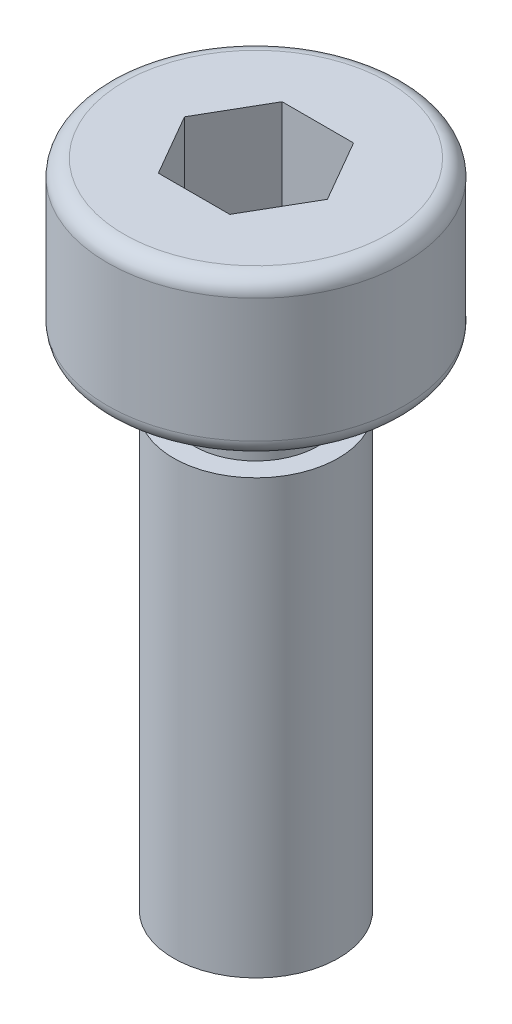
ISO-10303-21;
HEADER;
FILE_DESCRIPTION(('STEP AP214'),'2;1');
FILE_NAME('part.step','',(''),(''),'','','');
FILE_SCHEMA(('AUTOMOTIVE_DESIGN { 1 0 10303 214 1 1 1 1 }'));
ENDSEC;
DATA;
#1=APPLICATION_CONTEXT('core data for automotive mechanical design processes');
#2=APPLICATION_PROTOCOL_DEFINITION('international standard','automotive_design',2000,#1);
#3=PRODUCT_CONTEXT('',#1,'mechanical');
#4=PRODUCT('Part','Part','',(#3));
#5=PRODUCT_RELATED_PRODUCT_CATEGORY('part','',(#4));
#6=PRODUCT_DEFINITION_FORMATION('','',#4);
#7=PRODUCT_DEFINITION_CONTEXT('part definition',#1,'design');
#8=PRODUCT_DEFINITION('design','',#6,#7);
#9=PRODUCT_DEFINITION_SHAPE('','',#8);
#10=(LENGTH_UNIT() NAMED_UNIT(*) SI_UNIT(.MILLI.,.METRE.));
#11=(NAMED_UNIT(*) PLANE_ANGLE_UNIT() SI_UNIT($,.RADIAN.));
#12=(NAMED_UNIT(*) SI_UNIT($,.STERADIAN.) SOLID_ANGLE_UNIT());
#13=UNCERTAINTY_MEASURE_WITH_UNIT(LENGTH_MEASURE(1.E-05),#10,'distance_accuracy_value','');
#14=(GEOMETRIC_REPRESENTATION_CONTEXT(3) GLOBAL_UNCERTAINTY_ASSIGNED_CONTEXT((#13)) GLOBAL_UNIT_ASSIGNED_CONTEXT((#10,
#11,#12)) REPRESENTATION_CONTEXT('',''));
#15=CARTESIAN_POINT('',(0.,0.,0.));
#16=DIRECTION('',(0.,0.,1.));
#17=DIRECTION('',(1.,0.,0.));
#18=AXIS2_PLACEMENT_3D('',#15,#16,#17);
#19=CARTESIAN_POINT('',(0.,15.8,0.));
#20=DIRECTION('',(0.,-1.,0.));
#21=DIRECTION('',(0.,0.,-1.));
#22=AXIS2_PLACEMENT_3D('',#19,#20,#21);
#23=PLANE('',#22);
#24=DIRECTION('',(-0.5,0.,0.866025403784439));
#25=VECTOR('',#24,1.);
#26=CARTESIAN_POINT('',(-0.866025403784439,15.8,-1.5));
#27=LINE('',#26,#25);
#28=CARTESIAN_POINT('',(-0.866025403784439,15.8,-1.5));
#29=VERTEX_POINT('',#28);
#30=CARTESIAN_POINT('',(-1.73205080756888,15.8,0.));
#31=VERTEX_POINT('',#30);
#32=EDGE_CURVE('E124',#29,#31,#27,.T.);
#33=ORIENTED_EDGE('',*,*,#32,.F.);
#34=DIRECTION('',(-1.,0.,0.));
#35=VECTOR('',#34,1.);
#36=CARTESIAN_POINT('',(0.86602540378444,15.8,-1.5));
#37=LINE('',#36,#35);
#38=CARTESIAN_POINT('',(0.86602540378444,15.8,-1.5));
#39=VERTEX_POINT('',#38);
#40=EDGE_CURVE('E50',#39,#29,#37,.T.);
#41=ORIENTED_EDGE('',*,*,#40,.F.);
#42=DIRECTION('',(-0.5,0.,-0.866025403784439));
#43=VECTOR('',#42,1.);
#44=CARTESIAN_POINT('',(1.73205080756888,15.8,0.));
#45=LINE('',#44,#43);
#46=CARTESIAN_POINT('',(1.73205080756888,15.8,0.));
#47=VERTEX_POINT('',#46);
#48=EDGE_CURVE('E133',#47,#39,#45,.T.);
#49=ORIENTED_EDGE('',*,*,#48,.F.);
#50=DIRECTION('',(0.5,0.,-0.866025403784439));
#51=VECTOR('',#50,1.);
#52=CARTESIAN_POINT('',(0.866025403784438,15.8,1.5));
#53=LINE('',#52,#51);
#54=CARTESIAN_POINT('',(0.866025403784438,15.8,1.5));
#55=VERTEX_POINT('',#54);
#56=EDGE_CURVE('E131',#55,#47,#53,.T.);
#57=ORIENTED_EDGE('',*,*,#56,.F.);
#58=DIRECTION('',(1.,0.,0.));
#59=VECTOR('',#58,1.);
#60=CARTESIAN_POINT('',(-0.86602540378444,15.8,1.5));
#61=LINE('',#60,#59);
#62=CARTESIAN_POINT('',(-0.86602540378444,15.8,1.5));
#63=VERTEX_POINT('',#62);
#64=EDGE_CURVE('E98',#63,#55,#61,.T.);
#65=ORIENTED_EDGE('',*,*,#64,.F.);
#66=DIRECTION('',(0.5,0.,0.866025403784439));
#67=VECTOR('',#66,1.);
#68=CARTESIAN_POINT('',(-1.73205080756888,15.8,0.));
#69=LINE('',#68,#67);
#70=EDGE_CURVE('E127',#31,#63,#69,.T.);
#71=ORIENTED_EDGE('',*,*,#70,.F.);
#72=EDGE_LOOP('',(#33,#41,#49,#57,#65,#71));
#73=FACE_BOUND('',#72,.T.);
#74=CARTESIAN_POINT('',(0.,15.8,0.));
#75=DIRECTION('',(0.,-1.,0.));
#76=DIRECTION('',(0.,0.,-1.));
#77=AXIS2_PLACEMENT_3D('',#74,#75,#76);
#78=CIRCLE('',#77,3.2);
#79=CARTESIAN_POINT('',(0.,15.8,-3.2));
#80=VERTEX_POINT('',#79);
#81=EDGE_CURVE('E11',#80,#80,#78,.T.);
#82=ORIENTED_EDGE('',*,*,#81,.F.);
#83=EDGE_LOOP('',(#82));
#84=FACE_BOUND('',#83,.T.);
#85=ADVANCED_FACE('F36',(#73,#84),#23,.F.);
#86=CARTESIAN_POINT('',(0.,15.4,0.));
#87=DIRECTION('',(0.,-1.,0.));
#88=DIRECTION('',(0.,0.,-1.));
#89=AXIS2_PLACEMENT_3D('',#86,#87,#88);
#90=TOROIDAL_SURFACE('',#89,3.2,0.4);
#91=CARTESIAN_POINT('',(0.,15.4,0.));
#92=DIRECTION('',(0.,-1.,0.));
#93=DIRECTION('',(0.,0.,-1.));
#94=AXIS2_PLACEMENT_3D('',#91,#92,#93);
#95=CIRCLE('',#94,3.6);
#96=CARTESIAN_POINT('',(0.,15.4,-3.6));
#97=VERTEX_POINT('',#96);
#98=EDGE_CURVE('E43',#97,#97,#95,.T.);
#99=ORIENTED_EDGE('',*,*,#98,.F.);
#100=EDGE_LOOP('',(#99));
#101=FACE_BOUND('',#100,.T.);
#102=ORIENTED_EDGE('',*,*,#81,.T.);
#103=EDGE_LOOP('',(#102));
#104=FACE_BOUND('',#103,.T.);
#105=ADVANCED_FACE('F164',(#101,#104),#90,.T.);
#106=CARTESIAN_POINT('',(0.,0.,0.));
#107=DIRECTION('',(0.,-1.,0.));
#108=DIRECTION('',(0.,0.,-1.));
#109=AXIS2_PLACEMENT_3D('',#106,#107,#108);
#110=CYLINDRICAL_SURFACE('',#109,3.6);
#111=CARTESIAN_POINT('',(0.,12.4,0.));
#112=DIRECTION('',(0.,-1.,0.));
#113=DIRECTION('',(0.,0.,-1.));
#114=AXIS2_PLACEMENT_3D('',#111,#112,#113);
#115=CIRCLE('',#114,3.6);
#116=CARTESIAN_POINT('',(0.,12.4,-3.6));
#117=VERTEX_POINT('',#116);
#118=EDGE_CURVE('E157',#117,#117,#115,.T.);
#119=ORIENTED_EDGE('',*,*,#118,.F.);
#120=EDGE_LOOP('',(#119));
#121=FACE_BOUND('',#120,.T.);
#122=ORIENTED_EDGE('',*,*,#98,.T.);
#123=EDGE_LOOP('',(#122));
#124=FACE_BOUND('',#123,.T.);
#125=ADVANCED_FACE('F162',(#121,#124),#110,.T.);
#126=CARTESIAN_POINT('',(0.,12.4,0.));
#127=DIRECTION('',(0.,-1.,0.));
#128=DIRECTION('',(0.,0.,-1.));
#129=AXIS2_PLACEMENT_3D('',#126,#127,#128);
#130=TOROIDAL_SURFACE('',#129,3.2,0.4);
#131=CARTESIAN_POINT('',(0.,12.,0.));
#132=DIRECTION('',(0.,-1.,0.));
#133=DIRECTION('',(0.,0.,-1.));
#134=AXIS2_PLACEMENT_3D('',#131,#132,#133);
#135=CIRCLE('',#134,3.2);
#136=CARTESIAN_POINT('',(0.,12.,-3.2));
#137=VERTEX_POINT('',#136);
#138=EDGE_CURVE('E154',#137,#137,#135,.T.);
#139=ORIENTED_EDGE('',*,*,#138,.F.);
#140=EDGE_LOOP('',(#139));
#141=FACE_BOUND('',#140,.T.);
#142=ORIENTED_EDGE('',*,*,#118,.T.);
#143=EDGE_LOOP('',(#142));
#144=FACE_BOUND('',#143,.T.);
#145=ADVANCED_FACE('F209',(#141,#144),#130,.T.);
#146=CARTESIAN_POINT('',(-3.2,12.,0.));
#147=DIRECTION('',(0.,1.,0.));
#148=DIRECTION('',(0.,0.,1.));
#149=AXIS2_PLACEMENT_3D('',#146,#147,#148);
#150=PLANE('',#149);
#151=CARTESIAN_POINT('',(0.,12.,0.));
#152=DIRECTION('',(0.,-1.,0.));
#153=DIRECTION('',(0.,0.,-1.));
#154=AXIS2_PLACEMENT_3D('',#151,#152,#153);
#155=CIRCLE('',#154,1.5);
#156=CARTESIAN_POINT('',(0.,12.,-1.5));
#157=VERTEX_POINT('',#156);
#158=EDGE_CURVE('E151',#157,#157,#155,.T.);
#159=ORIENTED_EDGE('',*,*,#158,.F.);
#160=EDGE_LOOP('',(#159));
#161=FACE_BOUND('',#160,.T.);
#162=ORIENTED_EDGE('',*,*,#138,.T.);
#163=EDGE_LOOP('',(#162));
#164=FACE_BOUND('',#163,.T.);
#165=ADVANCED_FACE('F205',(#161,#164),#150,.F.);
#166=CARTESIAN_POINT('',(0.,0.,0.));
#167=DIRECTION('',(0.,-1.,0.));
#168=DIRECTION('',(0.,0.,-1.));
#169=AXIS2_PLACEMENT_3D('',#166,#167,#168);
#170=CYLINDRICAL_SURFACE('',#169,1.5);
#171=CARTESIAN_POINT('',(0.,10.5,0.));
#172=DIRECTION('',(0.,-1.,0.));
#173=DIRECTION('',(0.,0.,-1.));
#174=AXIS2_PLACEMENT_3D('',#171,#172,#173);
#175=CIRCLE('',#174,1.5);
#176=CARTESIAN_POINT('',(0.,10.5,-1.5));
#177=VERTEX_POINT('',#176);
#178=EDGE_CURVE('E148',#177,#177,#175,.T.);
#179=ORIENTED_EDGE('',*,*,#178,.F.);
#180=EDGE_LOOP('',(#179));
#181=FACE_BOUND('',#180,.T.);
#182=ORIENTED_EDGE('',*,*,#158,.T.);
#183=EDGE_LOOP('',(#182));
#184=FACE_BOUND('',#183,.T.);
#185=ADVANCED_FACE('F201',(#181,#184),#170,.T.);
#186=CARTESIAN_POINT('',(-1.5,10.5,0.));
#187=DIRECTION('',(0.,-1.,0.));
#188=DIRECTION('',(0.,0.,-1.));
#189=AXIS2_PLACEMENT_3D('',#186,#187,#188);
#190=PLANE('',#189);
#191=CARTESIAN_POINT('',(0.,10.5,0.));
#192=DIRECTION('',(0.,-1.,0.));
#193=DIRECTION('',(0.,0.,-1.));
#194=AXIS2_PLACEMENT_3D('',#191,#192,#193);
#195=CIRCLE('',#194,2.);
#196=CARTESIAN_POINT('',(0.,10.5,-2.));
#197=VERTEX_POINT('',#196);
#198=EDGE_CURVE('E145',#197,#197,#195,.T.);
#199=ORIENTED_EDGE('',*,*,#198,.F.);
#200=EDGE_LOOP('',(#199));
#201=FACE_BOUND('',#200,.T.);
#202=ORIENTED_EDGE('',*,*,#178,.T.);
#203=EDGE_LOOP('',(#202));
#204=FACE_BOUND('',#203,.T.);
#205=ADVANCED_FACE('F197',(#201,#204),#190,.F.);
#206=CARTESIAN_POINT('',(0.,0.,0.));
#207=DIRECTION('',(0.,-1.,0.));
#208=DIRECTION('',(0.,0.,-1.));
#209=AXIS2_PLACEMENT_3D('',#206,#207,#208);
#210=CYLINDRICAL_SURFACE('',#209,2.);
#211=CARTESIAN_POINT('',(0.,0.,0.));
#212=DIRECTION('',(0.,-1.,0.));
#213=DIRECTION('',(0.,0.,-1.));
#214=AXIS2_PLACEMENT_3D('',#211,#212,#213);
#215=CIRCLE('',#214,2.);
#216=CARTESIAN_POINT('',(0.,0.,-2.));
#217=VERTEX_POINT('',#216);
#218=EDGE_CURVE('E137',#217,#217,#215,.T.);
#219=ORIENTED_EDGE('',*,*,#218,.F.);
#220=EDGE_LOOP('',(#219));
#221=FACE_BOUND('',#220,.T.);
#222=ORIENTED_EDGE('',*,*,#198,.T.);
#223=EDGE_LOOP('',(#222));
#224=FACE_BOUND('',#223,.T.);
#225=ADVANCED_FACE('F189',(#221,#224),#210,.T.);
#226=CARTESIAN_POINT('',(-2.,0.,0.));
#227=DIRECTION('',(0.,1.,0.));
#228=DIRECTION('',(0.,0.,1.));
#229=AXIS2_PLACEMENT_3D('',#226,#227,#228);
#230=PLANE('',#229);
#231=ORIENTED_EDGE('',*,*,#218,.T.);
#232=EDGE_LOOP('',(#231));
#233=FACE_BOUND('',#232,.T.);
#234=ADVANCED_FACE('F182',(#233),#230,.F.);
#235=CARTESIAN_POINT('',(0.86602540378444,13.,-1.5));
#236=DIRECTION('',(0.,0.,-1.));
#237=DIRECTION('',(-1.,0.,0.));
#238=AXIS2_PLACEMENT_3D('',#235,#236,#237);
#239=PLANE('',#238);
#240=ORIENTED_EDGE('',*,*,#40,.T.);
#241=DIRECTION('',(0.,1.,0.));
#242=VECTOR('',#241,1.);
#243=CARTESIAN_POINT('',(-0.866025403784439,13.,-1.5));
#244=LINE('',#243,#242);
#245=CARTESIAN_POINT('',(-0.866025403784439,13.,-1.5));
#246=VERTEX_POINT('',#245);
#247=EDGE_CURVE('E80',#246,#29,#244,.T.);
#248=ORIENTED_EDGE('',*,*,#247,.F.);
#249=DIRECTION('',(-1.,0.,0.));
#250=VECTOR('',#249,1.);
#251=CARTESIAN_POINT('',(0.86602540378444,13.,-1.5));
#252=LINE('',#251,#250);
#253=CARTESIAN_POINT('',(0.86602540378444,13.,-1.5));
#254=VERTEX_POINT('',#253);
#255=EDGE_CURVE('E135',#254,#246,#252,.T.);
#256=ORIENTED_EDGE('',*,*,#255,.F.);
#257=DIRECTION('',(0.,1.,0.));
#258=VECTOR('',#257,1.);
#259=CARTESIAN_POINT('',(0.86602540378444,13.,-1.5));
#260=LINE('',#259,#258);
#261=EDGE_CURVE('E58',#254,#39,#260,.T.);
#262=ORIENTED_EDGE('',*,*,#261,.T.);
#263=EDGE_LOOP('',(#240,#248,#256,#262));
#264=FACE_BOUND('',#263,.T.);
#265=ADVANCED_FACE('F179',(#264),#239,.F.);
#266=CARTESIAN_POINT('',(1.73205080756888,13.,0.));
#267=DIRECTION('',(0.866025403784439,0.,-0.5));
#268=DIRECTION('',(-0.5,0.,-0.866025403784439));
#269=AXIS2_PLACEMENT_3D('',#266,#267,#268);
#270=PLANE('',#269);
#271=ORIENTED_EDGE('',*,*,#48,.T.);
#272=ORIENTED_EDGE('',*,*,#261,.F.);
#273=DIRECTION('',(-0.5,0.,-0.866025403784439));
#274=VECTOR('',#273,1.);
#275=CARTESIAN_POINT('',(1.73205080756888,13.,0.));
#276=LINE('',#275,#274);
#277=CARTESIAN_POINT('',(1.73205080756888,13.,0.));
#278=VERTEX_POINT('',#277);
#279=EDGE_CURVE('E110',#278,#254,#276,.T.);
#280=ORIENTED_EDGE('',*,*,#279,.F.);
#281=DIRECTION('',(0.,1.,0.));
#282=VECTOR('',#281,1.);
#283=CARTESIAN_POINT('',(1.73205080756888,13.,0.));
#284=LINE('',#283,#282);
#285=EDGE_CURVE('E102',#278,#47,#284,.T.);
#286=ORIENTED_EDGE('',*,*,#285,.T.);
#287=EDGE_LOOP('',(#271,#272,#280,#286));
#288=FACE_BOUND('',#287,.T.);
#289=ADVANCED_FACE('F181',(#288),#270,.F.);
#290=CARTESIAN_POINT('',(0.866025403784438,13.,1.5));
#291=DIRECTION('',(0.866025403784439,0.,0.5));
#292=DIRECTION('',(0.5,0.,-0.866025403784438));
#293=AXIS2_PLACEMENT_3D('',#290,#291,#292);
#294=PLANE('',#293);
#295=ORIENTED_EDGE('',*,*,#56,.T.);
#296=ORIENTED_EDGE('',*,*,#285,.F.);
#297=DIRECTION('',(0.5,0.,-0.866025403784439));
#298=VECTOR('',#297,1.);
#299=CARTESIAN_POINT('',(0.866025403784438,13.,1.5));
#300=LINE('',#299,#298);
#301=CARTESIAN_POINT('',(0.866025403784438,13.,1.5));
#302=VERTEX_POINT('',#301);
#303=EDGE_CURVE('E106',#302,#278,#300,.T.);
#304=ORIENTED_EDGE('',*,*,#303,.F.);
#305=DIRECTION('',(0.,1.,0.));
#306=VECTOR('',#305,1.);
#307=CARTESIAN_POINT('',(0.866025403784438,13.,1.5));
#308=LINE('',#307,#306);
#309=EDGE_CURVE('E91',#302,#55,#308,.T.);
#310=ORIENTED_EDGE('',*,*,#309,.T.);
#311=EDGE_LOOP('',(#295,#296,#304,#310));
#312=FACE_BOUND('',#311,.T.);
#313=ADVANCED_FACE('F107',(#312),#294,.F.);
#314=CARTESIAN_POINT('',(-0.86602540378444,13.,1.5));
#315=DIRECTION('',(0.,0.,1.));
#316=DIRECTION('',(1.,0.,0.));
#317=AXIS2_PLACEMENT_3D('',#314,#315,#316);
#318=PLANE('',#317);
#319=ORIENTED_EDGE('',*,*,#64,.T.);
#320=ORIENTED_EDGE('',*,*,#309,.F.);
#321=DIRECTION('',(1.,0.,0.));
#322=VECTOR('',#321,1.);
#323=CARTESIAN_POINT('',(-0.86602540378444,13.,1.5));
#324=LINE('',#323,#322);
#325=CARTESIAN_POINT('',(-0.86602540378444,13.,1.5));
#326=VERTEX_POINT('',#325);
#327=EDGE_CURVE('E95',#326,#302,#324,.T.);
#328=ORIENTED_EDGE('',*,*,#327,.F.);
#329=DIRECTION('',(0.,1.,0.));
#330=VECTOR('',#329,1.);
#331=CARTESIAN_POINT('',(-0.86602540378444,13.,1.5));
#332=LINE('',#331,#330);
#333=EDGE_CURVE('E103',#326,#63,#332,.T.);
#334=ORIENTED_EDGE('',*,*,#333,.T.);
#335=EDGE_LOOP('',(#319,#320,#328,#334));
#336=FACE_BOUND('',#335,.T.);
#337=ADVANCED_FACE('F93',(#336),#318,.F.);
#338=CARTESIAN_POINT('',(-1.73205080756888,13.,0.));
#339=DIRECTION('',(-0.866025403784439,0.,0.5));
#340=DIRECTION('',(0.5,0.,0.866025403784439));
#341=AXIS2_PLACEMENT_3D('',#338,#339,#340);
#342=PLANE('',#341);
#343=ORIENTED_EDGE('',*,*,#70,.T.);
#344=ORIENTED_EDGE('',*,*,#333,.F.);
#345=DIRECTION('',(0.5,0.,0.866025403784439));
#346=VECTOR('',#345,1.);
#347=CARTESIAN_POINT('',(-1.73205080756888,13.,0.));
#348=LINE('',#347,#346);
#349=CARTESIAN_POINT('',(-1.73205080756888,13.,0.));
#350=VERTEX_POINT('',#349);
#351=EDGE_CURVE('E116',#350,#326,#348,.T.);
#352=ORIENTED_EDGE('',*,*,#351,.F.);
#353=DIRECTION('',(0.,1.,0.));
#354=VECTOR('',#353,1.);
#355=CARTESIAN_POINT('',(-1.73205080756888,13.,0.));
#356=LINE('',#355,#354);
#357=EDGE_CURVE('E140',#350,#31,#356,.T.);
#358=ORIENTED_EDGE('',*,*,#357,.T.);
#359=EDGE_LOOP('',(#343,#344,#352,#358));
#360=FACE_BOUND('',#359,.T.);
#361=ADVANCED_FACE('F280',(#360),#342,.F.);
#362=CARTESIAN_POINT('',(-0.866025403784439,13.,-1.5));
#363=DIRECTION('',(-0.866025403784439,0.,-0.5));
#364=DIRECTION('',(-0.5,0.,0.866025403784439));
#365=AXIS2_PLACEMENT_3D('',#362,#363,#364);
#366=PLANE('',#365);
#367=ORIENTED_EDGE('',*,*,#32,.T.);
#368=ORIENTED_EDGE('',*,*,#357,.F.);
#369=DIRECTION('',(-0.5,0.,0.866025403784439));
#370=VECTOR('',#369,1.);
#371=CARTESIAN_POINT('',(-0.866025403784439,13.,-1.5));
#372=LINE('',#371,#370);
#373=EDGE_CURVE('E118',#246,#350,#372,.T.);
#374=ORIENTED_EDGE('',*,*,#373,.F.);
#375=ORIENTED_EDGE('',*,*,#247,.T.);
#376=EDGE_LOOP('',(#367,#368,#374,#375));
#377=FACE_BOUND('',#376,.T.);
#378=ADVANCED_FACE('F177',(#377),#366,.F.);
#379=CARTESIAN_POINT('',(0.,13.,0.));
#380=DIRECTION('',(0.,1.,0.));
#381=DIRECTION('',(0.,0.,1.));
#382=AXIS2_PLACEMENT_3D('',#379,#380,#381);
#383=PLANE('',#382);
#384=ORIENTED_EDGE('',*,*,#255,.T.);
#385=ORIENTED_EDGE('',*,*,#373,.T.);
#386=ORIENTED_EDGE('',*,*,#351,.T.);
#387=ORIENTED_EDGE('',*,*,#327,.T.);
#388=ORIENTED_EDGE('',*,*,#303,.T.);
#389=ORIENTED_EDGE('',*,*,#279,.T.);
#390=EDGE_LOOP('',(#384,#385,#386,#387,#388,#389));
#391=FACE_BOUND('',#390,.T.);
#392=ADVANCED_FACE('F113',(#391),#383,.T.);
#393=CLOSED_SHELL('',(#85,#105,#125,#145,#165,#185,#205,#225,#234,#265,#289,#313,#337,#361,#378,#392));
#394=MANIFOLD_SOLID_BREP('B2',#393);
#395=ADVANCED_BREP_SHAPE_REPRESENTATION('',(#18,#394),#14);
#396=SHAPE_DEFINITION_REPRESENTATION(#9,#395);
ENDSEC;
END-ISO-10303-21;
